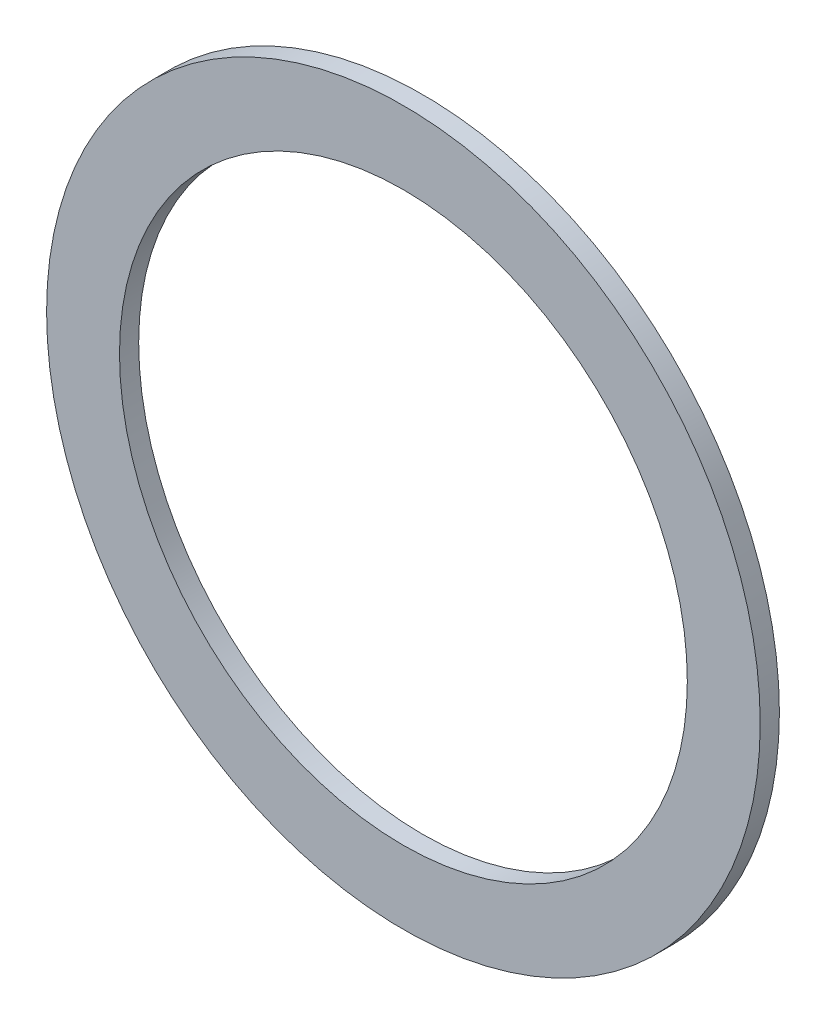
ISO-10303-21;
HEADER;
FILE_DESCRIPTION(('STEP AP214'),'2;1');
FILE_NAME('part.step','',(''),(''),'','','');
FILE_SCHEMA(('AUTOMOTIVE_DESIGN { 1 0 10303 214 1 1 1 1 }'));
ENDSEC;
DATA;
#1=APPLICATION_CONTEXT('core data for automotive mechanical design processes');
#2=APPLICATION_PROTOCOL_DEFINITION('international standard','automotive_design',2000,#1);
#3=PRODUCT_CONTEXT('',#1,'mechanical');
#4=PRODUCT('Part','Part','',(#3));
#5=PRODUCT_RELATED_PRODUCT_CATEGORY('part','',(#4));
#6=PRODUCT_DEFINITION_FORMATION('','',#4);
#7=PRODUCT_DEFINITION_CONTEXT('part definition',#1,'design');
#8=PRODUCT_DEFINITION('design','',#6,#7);
#9=PRODUCT_DEFINITION_SHAPE('','',#8);
#10=(LENGTH_UNIT() NAMED_UNIT(*) SI_UNIT(.MILLI.,.METRE.));
#11=(NAMED_UNIT(*) PLANE_ANGLE_UNIT() SI_UNIT($,.RADIAN.));
#12=(NAMED_UNIT(*) SI_UNIT($,.STERADIAN.) SOLID_ANGLE_UNIT());
#13=UNCERTAINTY_MEASURE_WITH_UNIT(LENGTH_MEASURE(1.E-05),#10,'distance_accuracy_value','');
#14=(GEOMETRIC_REPRESENTATION_CONTEXT(3) GLOBAL_UNCERTAINTY_ASSIGNED_CONTEXT((#13)) GLOBAL_UNIT_ASSIGNED_CONTEXT((#10,
#11,#12)) REPRESENTATION_CONTEXT('',''));
#15=CARTESIAN_POINT('',(0.,0.,0.));
#16=DIRECTION('',(0.,0.,1.));
#17=DIRECTION('',(1.,0.,0.));
#18=AXIS2_PLACEMENT_3D('',#15,#16,#17);
#19=CARTESIAN_POINT('',(0.,0.,0.5));
#20=DIRECTION('',(0.,0.,1.));
#21=DIRECTION('',(1.,0.,0.));
#22=AXIS2_PLACEMENT_3D('',#19,#20,#21);
#23=PLANE('',#22);
#24=CARTESIAN_POINT('',(0.,0.,0.5));
#25=DIRECTION('',(0.,0.,1.));
#26=DIRECTION('',(1.,0.,0.));
#27=AXIS2_PLACEMENT_3D('',#24,#25,#26);
#28=CIRCLE('',#27,9.3);
#29=CARTESIAN_POINT('',(9.3,0.,0.5));
#30=VERTEX_POINT('',#29);
#31=EDGE_CURVE('E10',#30,#30,#28,.T.);
#32=ORIENTED_EDGE('',*,*,#31,.T.);
#33=EDGE_LOOP('',(#32));
#34=FACE_BOUND('',#33,.T.);
#35=CARTESIAN_POINT('',(0.,0.,0.5));
#36=DIRECTION('',(0.,0.,1.));
#37=DIRECTION('',(1.,0.,0.));
#38=AXIS2_PLACEMENT_3D('',#35,#36,#37);
#39=CIRCLE('',#38,7.4);
#40=CARTESIAN_POINT('',(7.4,0.,0.5));
#41=VERTEX_POINT('',#40);
#42=EDGE_CURVE('E50',#41,#41,#39,.T.);
#43=ORIENTED_EDGE('',*,*,#42,.F.);
#44=EDGE_LOOP('',(#43));
#45=FACE_BOUND('',#44,.T.);
#46=ADVANCED_FACE('F37',(#34,#45),#23,.T.);
#47=CARTESIAN_POINT('',(0.,0.,0.));
#48=DIRECTION('',(0.,0.,1.));
#49=DIRECTION('',(1.,0.,0.));
#50=AXIS2_PLACEMENT_3D('',#47,#48,#49);
#51=PLANE('',#50);
#52=CARTESIAN_POINT('',(0.,0.,0.));
#53=DIRECTION('',(0.,0.,1.));
#54=DIRECTION('',(1.,0.,0.));
#55=AXIS2_PLACEMENT_3D('',#52,#53,#54);
#56=CIRCLE('',#55,9.3);
#57=CARTESIAN_POINT('',(9.3,0.,0.));
#58=VERTEX_POINT('',#57);
#59=EDGE_CURVE('E41',#58,#58,#56,.T.);
#60=ORIENTED_EDGE('',*,*,#59,.F.);
#61=EDGE_LOOP('',(#60));
#62=FACE_BOUND('',#61,.T.);
#63=CARTESIAN_POINT('',(0.,0.,0.));
#64=DIRECTION('',(0.,0.,1.));
#65=DIRECTION('',(1.,0.,0.));
#66=AXIS2_PLACEMENT_3D('',#63,#64,#65);
#67=CIRCLE('',#66,7.4);
#68=CARTESIAN_POINT('',(7.4,0.,0.));
#69=VERTEX_POINT('',#68);
#70=EDGE_CURVE('E52',#69,#69,#67,.T.);
#71=ORIENTED_EDGE('',*,*,#70,.T.);
#72=EDGE_LOOP('',(#71));
#73=FACE_BOUND('',#72,.T.);
#74=ADVANCED_FACE('F64',(#62,#73),#51,.F.);
#75=CARTESIAN_POINT('',(0.,0.,0.5));
#76=DIRECTION('',(0.,0.,-1.));
#77=DIRECTION('',(-1.,0.,0.));
#78=AXIS2_PLACEMENT_3D('',#75,#76,#77);
#79=CYLINDRICAL_SURFACE('',#78,9.3);
#80=ORIENTED_EDGE('',*,*,#31,.F.);
#81=EDGE_LOOP('',(#80));
#82=FACE_BOUND('',#81,.T.);
#83=ORIENTED_EDGE('',*,*,#59,.T.);
#84=EDGE_LOOP('',(#83));
#85=FACE_BOUND('',#84,.T.);
#86=ADVANCED_FACE('F39',(#82,#85),#79,.T.);
#87=CARTESIAN_POINT('',(0.,0.,0.5));
#88=DIRECTION('',(0.,0.,-1.));
#89=DIRECTION('',(-1.,0.,0.));
#90=AXIS2_PLACEMENT_3D('',#87,#88,#89);
#91=CYLINDRICAL_SURFACE('',#90,7.4);
#92=ORIENTED_EDGE('',*,*,#42,.T.);
#93=EDGE_LOOP('',(#92));
#94=FACE_BOUND('',#93,.T.);
#95=ORIENTED_EDGE('',*,*,#70,.F.);
#96=EDGE_LOOP('',(#95));
#97=FACE_BOUND('',#96,.T.);
#98=ADVANCED_FACE('F60',(#94,#97),#91,.F.);
#99=CLOSED_SHELL('',(#46,#74,#86,#98));
#100=MANIFOLD_SOLID_BREP('B2',#99);
#101=ADVANCED_BREP_SHAPE_REPRESENTATION('',(#18,#100),#14);
#102=SHAPE_DEFINITION_REPRESENTATION(#9,#101);
ENDSEC;
END-ISO-10303-21;
